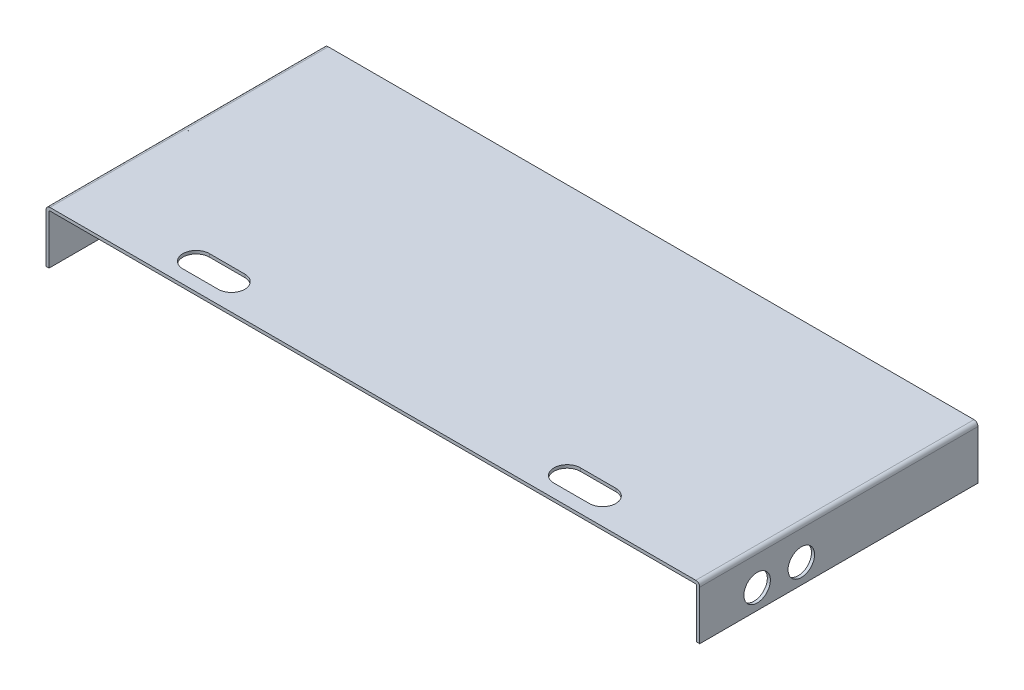
ISO-10303-21;
HEADER;
FILE_DESCRIPTION(('STEP AP214'),'2;1');
FILE_NAME('part.step','',(''),(''),'','','');
FILE_SCHEMA(('AUTOMOTIVE_DESIGN { 1 0 10303 214 1 1 1 1 }'));
ENDSEC;
DATA;
#1=APPLICATION_CONTEXT('core data for automotive mechanical design processes');
#2=APPLICATION_PROTOCOL_DEFINITION('international standard','automotive_design',2000,#1);
#3=PRODUCT_CONTEXT('',#1,'mechanical');
#4=PRODUCT('Part','Part','',(#3));
#5=PRODUCT_RELATED_PRODUCT_CATEGORY('part','',(#4));
#6=PRODUCT_DEFINITION_FORMATION('','',#4);
#7=PRODUCT_DEFINITION_CONTEXT('part definition',#1,'design');
#8=PRODUCT_DEFINITION('design','',#6,#7);
#9=PRODUCT_DEFINITION_SHAPE('','',#8);
#10=(LENGTH_UNIT() NAMED_UNIT(*) SI_UNIT(.MILLI.,.METRE.));
#11=(NAMED_UNIT(*) PLANE_ANGLE_UNIT() SI_UNIT($,.RADIAN.));
#12=(NAMED_UNIT(*) SI_UNIT($,.STERADIAN.) SOLID_ANGLE_UNIT());
#13=UNCERTAINTY_MEASURE_WITH_UNIT(LENGTH_MEASURE(1.E-05),#10,'distance_accuracy_value','');
#14=(GEOMETRIC_REPRESENTATION_CONTEXT(3) GLOBAL_UNCERTAINTY_ASSIGNED_CONTEXT((#13)) GLOBAL_UNIT_ASSIGNED_CONTEXT((#10,
#11,#12)) REPRESENTATION_CONTEXT('',''));
#15=CARTESIAN_POINT('',(0.,0.,0.));
#16=DIRECTION('',(0.,0.,1.));
#17=DIRECTION('',(1.,0.,0.));
#18=AXIS2_PLACEMENT_3D('',#15,#16,#17);
#19=CARTESIAN_POINT('',(-74.,-12.01,-23.));
#20=DIRECTION('',(0.,0.,1.));
#21=DIRECTION('',(1.,0.,0.));
#22=AXIS2_PLACEMENT_3D('',#19,#20,#21);
#23=PLANE('',#22);
#24=CARTESIAN_POINT('',(73.1,-0.900000000000012,-23.));
#25=DIRECTION('',(0.,0.,1.));
#26=DIRECTION('',(1.,0.,0.));
#27=AXIS2_PLACEMENT_3D('',#24,#25,#26);
#28=CIRCLE('',#27,0.899999999999992);
#29=CARTESIAN_POINT('',(73.1,0.,-23.));
#30=VERTEX_POINT('',#29);
#31=CARTESIAN_POINT('',(74.,-0.90000000000001,-23.));
#32=VERTEX_POINT('',#31);
#33=EDGE_CURVE('E247',#30,#32,#28,.F.);
#34=ORIENTED_EDGE('',*,*,#33,.T.);
#35=DIRECTION('',(0.,1.,0.));
#36=VECTOR('',#35,1.);
#37=CARTESIAN_POINT('',(74.,1.84206213535114E-13,-23.));
#38=LINE('',#37,#36);
#39=CARTESIAN_POINT('',(74.,-12.,-23.));
#40=VERTEX_POINT('',#39);
#41=EDGE_CURVE('E276',#40,#32,#38,.T.);
#42=ORIENTED_EDGE('',*,*,#41,.F.);
#43=DIRECTION('',(1.,0.,0.));
#44=VECTOR('',#43,1.);
#45=CARTESIAN_POINT('',(74.,-12.,-23.));
#46=LINE('',#45,#44);
#47=CARTESIAN_POINT('',(73.3,-12.,-23.));
#48=VERTEX_POINT('',#47);
#49=EDGE_CURVE('E275',#48,#40,#46,.T.);
#50=ORIENTED_EDGE('',*,*,#49,.F.);
#51=DIRECTION('',(0.,1.,0.));
#52=VECTOR('',#51,1.);
#53=CARTESIAN_POINT('',(73.3,1.81762176597924E-13,-23.));
#54=LINE('',#53,#52);
#55=CARTESIAN_POINT('',(73.3,-0.900000000000012,-23.));
#56=VERTEX_POINT('',#55);
#57=EDGE_CURVE('E250',#48,#56,#54,.T.);
#58=ORIENTED_EDGE('',*,*,#57,.T.);
#59=CARTESIAN_POINT('',(73.1,-0.900000000000012,-23.));
#60=DIRECTION('',(0.,0.,1.));
#61=DIRECTION('',(1.,0.,0.));
#62=AXIS2_PLACEMENT_3D('',#59,#60,#61);
#63=CIRCLE('',#62,0.199999999999992);
#64=CARTESIAN_POINT('',(73.1,-0.700000000000021,-23.));
#65=VERTEX_POINT('',#64);
#66=EDGE_CURVE('E272',#65,#56,#63,.F.);
#67=ORIENTED_EDGE('',*,*,#66,.F.);
#68=DIRECTION('',(1.,0.,0.));
#69=VECTOR('',#68,1.);
#70=CARTESIAN_POINT('',(0.,-0.7,-23.));
#71=LINE('',#70,#69);
#72=CARTESIAN_POINT('',(-73.1,-0.700000000000007,-23.));
#73=VERTEX_POINT('',#72);
#74=EDGE_CURVE('E200',#73,#65,#71,.T.);
#75=ORIENTED_EDGE('',*,*,#74,.F.);
#76=CARTESIAN_POINT('',(-73.1,-0.900000000000013,-23.));
#77=DIRECTION('',(0.,0.,1.));
#78=DIRECTION('',(1.,0.,0.));
#79=AXIS2_PLACEMENT_3D('',#76,#77,#78);
#80=CIRCLE('',#79,0.200000000000006);
#81=CARTESIAN_POINT('',(-73.3,-0.900000000000012,-23.));
#82=VERTEX_POINT('',#81);
#83=EDGE_CURVE('E197',#82,#73,#80,.F.);
#84=ORIENTED_EDGE('',*,*,#83,.F.);
#85=DIRECTION('',(0.,-1.,0.));
#86=VECTOR('',#85,1.);
#87=CARTESIAN_POINT('',(-73.3,2.72643264896886E-13,-23.));
#88=LINE('',#87,#86);
#89=CARTESIAN_POINT('',(-73.3,-12.,-23.));
#90=VERTEX_POINT('',#89);
#91=EDGE_CURVE('E43',#82,#90,#88,.T.);
#92=ORIENTED_EDGE('',*,*,#91,.T.);
#93=DIRECTION('',(1.,0.,0.));
#94=VECTOR('',#93,1.);
#95=CARTESIAN_POINT('',(-74.,-12.,-23.));
#96=LINE('',#95,#94);
#97=CARTESIAN_POINT('',(-74.,-12.,-23.));
#98=VERTEX_POINT('',#97);
#99=EDGE_CURVE('E280',#98,#90,#96,.T.);
#100=ORIENTED_EDGE('',*,*,#99,.F.);
#101=DIRECTION('',(0.,-1.,0.));
#102=VECTOR('',#101,1.);
#103=CARTESIAN_POINT('',(-74.,2.75087301834076E-13,-23.));
#104=LINE('',#103,#102);
#105=CARTESIAN_POINT('',(-74.,-0.900000000000009,-23.));
#106=VERTEX_POINT('',#105);
#107=EDGE_CURVE('E203',#106,#98,#104,.T.);
#108=ORIENTED_EDGE('',*,*,#107,.F.);
#109=CARTESIAN_POINT('',(-73.1,-0.900000000000013,-23.));
#110=DIRECTION('',(0.,0.,1.));
#111=DIRECTION('',(1.,0.,0.));
#112=AXIS2_PLACEMENT_3D('',#109,#110,#111);
#113=CIRCLE('',#112,0.900000000000006);
#114=CARTESIAN_POINT('',(-73.1,0.,-23.));
#115=VERTEX_POINT('',#114);
#116=EDGE_CURVE('E253',#106,#115,#113,.F.);
#117=ORIENTED_EDGE('',*,*,#116,.T.);
#118=DIRECTION('',(1.,0.,0.));
#119=VECTOR('',#118,1.);
#120=CARTESIAN_POINT('',(0.,0.,-23.));
#121=LINE('',#120,#119);
#122=EDGE_CURVE('E244',#115,#30,#121,.T.);
#123=ORIENTED_EDGE('',*,*,#122,.T.);
#124=EDGE_LOOP('',(#34,#42,#50,#58,#67,#75,#84,#92,#100,#108,#117,#123));
#125=FACE_BOUND('',#124,.T.);
#126=ADVANCED_FACE('F39',(#125),#23,.F.);
#127=CARTESIAN_POINT('',(-74.,-12.01,40.));
#128=DIRECTION('',(0.,0.,1.));
#129=DIRECTION('',(1.,0.,0.));
#130=AXIS2_PLACEMENT_3D('',#127,#128,#129);
#131=PLANE('',#130);
#132=CARTESIAN_POINT('',(73.1,-0.900000000000012,40.));
#133=DIRECTION('',(0.,0.,1.));
#134=DIRECTION('',(1.,0.,0.));
#135=AXIS2_PLACEMENT_3D('',#132,#133,#134);
#136=CIRCLE('',#135,0.899999999999992);
#137=CARTESIAN_POINT('',(73.1,0.,40.));
#138=VERTEX_POINT('',#137);
#139=CARTESIAN_POINT('',(74.,-0.90000000000001,40.));
#140=VERTEX_POINT('',#139);
#141=EDGE_CURVE('E269',#138,#140,#136,.F.);
#142=ORIENTED_EDGE('',*,*,#141,.F.);
#143=DIRECTION('',(1.,0.,0.));
#144=VECTOR('',#143,1.);
#145=CARTESIAN_POINT('',(0.,0.,40.));
#146=LINE('',#145,#144);
#147=CARTESIAN_POINT('',(-73.1,0.,40.));
#148=VERTEX_POINT('',#147);
#149=EDGE_CURVE('E266',#148,#138,#146,.T.);
#150=ORIENTED_EDGE('',*,*,#149,.F.);
#151=CARTESIAN_POINT('',(-73.1,-0.900000000000013,40.));
#152=DIRECTION('',(0.,0.,1.));
#153=DIRECTION('',(1.,0.,0.));
#154=AXIS2_PLACEMENT_3D('',#151,#152,#153);
#155=CIRCLE('',#154,0.900000000000006);
#156=CARTESIAN_POINT('',(-74.,-0.900000000000009,40.));
#157=VERTEX_POINT('',#156);
#158=EDGE_CURVE('E204',#157,#148,#155,.F.);
#159=ORIENTED_EDGE('',*,*,#158,.F.);
#160=DIRECTION('',(0.,-1.,0.));
#161=VECTOR('',#160,1.);
#162=CARTESIAN_POINT('',(-74.,2.75087301834076E-13,40.));
#163=LINE('',#162,#161);
#164=CARTESIAN_POINT('',(-74.,-12.,40.));
#165=VERTEX_POINT('',#164);
#166=EDGE_CURVE('E195',#157,#165,#163,.T.);
#167=ORIENTED_EDGE('',*,*,#166,.T.);
#168=DIRECTION('',(1.,0.,0.));
#169=VECTOR('',#168,1.);
#170=CARTESIAN_POINT('',(-74.,-12.,40.));
#171=LINE('',#170,#169);
#172=CARTESIAN_POINT('',(-73.3,-12.,40.));
#173=VERTEX_POINT('',#172);
#174=EDGE_CURVE('E281',#173,#165,#171,.F.);
#175=ORIENTED_EDGE('',*,*,#174,.F.);
#176=DIRECTION('',(0.,-1.,0.));
#177=VECTOR('',#176,1.);
#178=CARTESIAN_POINT('',(-73.3,2.72643264896886E-13,40.));
#179=LINE('',#178,#177);
#180=CARTESIAN_POINT('',(-73.3,-0.900000000000012,40.));
#181=VERTEX_POINT('',#180);
#182=EDGE_CURVE('E278',#181,#173,#179,.T.);
#183=ORIENTED_EDGE('',*,*,#182,.F.);
#184=CARTESIAN_POINT('',(-73.1,-0.900000000000013,40.));
#185=DIRECTION('',(0.,0.,1.));
#186=DIRECTION('',(1.,0.,0.));
#187=AXIS2_PLACEMENT_3D('',#184,#185,#186);
#188=CIRCLE('',#187,0.200000000000006);
#189=CARTESIAN_POINT('',(-73.1,-0.700000000000007,40.));
#190=VERTEX_POINT('',#189);
#191=EDGE_CURVE('E209',#181,#190,#188,.F.);
#192=ORIENTED_EDGE('',*,*,#191,.T.);
#193=DIRECTION('',(1.,0.,0.));
#194=VECTOR('',#193,1.);
#195=CARTESIAN_POINT('',(0.,-0.7,40.));
#196=LINE('',#195,#194);
#197=CARTESIAN_POINT('',(73.1,-0.700000000000021,40.));
#198=VERTEX_POINT('',#197);
#199=EDGE_CURVE('E246',#190,#198,#196,.T.);
#200=ORIENTED_EDGE('',*,*,#199,.T.);
#201=CARTESIAN_POINT('',(73.1,-0.900000000000012,40.));
#202=DIRECTION('',(0.,0.,1.));
#203=DIRECTION('',(1.,0.,0.));
#204=AXIS2_PLACEMENT_3D('',#201,#202,#203);
#205=CIRCLE('',#204,0.199999999999992);
#206=CARTESIAN_POINT('',(73.3,-0.900000000000012,40.));
#207=VERTEX_POINT('',#206);
#208=EDGE_CURVE('E249',#198,#207,#205,.F.);
#209=ORIENTED_EDGE('',*,*,#208,.T.);
#210=DIRECTION('',(0.,1.,0.));
#211=VECTOR('',#210,1.);
#212=CARTESIAN_POINT('',(73.3,1.81762176597924E-13,40.));
#213=LINE('',#212,#211);
#214=CARTESIAN_POINT('',(73.3,-12.,40.));
#215=VERTEX_POINT('',#214);
#216=EDGE_CURVE('E273',#215,#207,#213,.T.);
#217=ORIENTED_EDGE('',*,*,#216,.F.);
#218=DIRECTION('',(-1.,0.,0.));
#219=VECTOR('',#218,1.);
#220=CARTESIAN_POINT('',(74.,-12.,40.));
#221=LINE('',#220,#219);
#222=CARTESIAN_POINT('',(74.,-12.,40.));
#223=VERTEX_POINT('',#222);
#224=EDGE_CURVE('E283',#223,#215,#221,.T.);
#225=ORIENTED_EDGE('',*,*,#224,.F.);
#226=DIRECTION('',(0.,1.,0.));
#227=VECTOR('',#226,1.);
#228=CARTESIAN_POINT('',(74.,1.84206213535114E-13,40.));
#229=LINE('',#228,#227);
#230=EDGE_CURVE('E252',#223,#140,#229,.T.);
#231=ORIENTED_EDGE('',*,*,#230,.T.);
#232=EDGE_LOOP('',(#142,#150,#159,#167,#175,#183,#192,#200,#209,#217,#225,#231));
#233=FACE_BOUND('',#232,.T.);
#234=ADVANCED_FACE('F375',(#233),#131,.T.);
#235=CARTESIAN_POINT('',(-46.,-0.7,37.));
#236=DIRECTION('',(0.,0.,1.));
#237=DIRECTION('',(1.,0.,0.));
#238=AXIS2_PLACEMENT_3D('',#235,#236,#237);
#239=PLANE('',#238);
#240=DIRECTION('',(1.,0.,0.));
#241=VECTOR('',#240,1.);
#242=CARTESIAN_POINT('',(-46.,0.,37.));
#243=LINE('',#242,#241);
#244=CARTESIAN_POINT('',(-46.,0.,37.));
#245=VERTEX_POINT('',#244);
#246=CARTESIAN_POINT('',(-38.,0.,37.));
#247=VERTEX_POINT('',#246);
#248=EDGE_CURVE('E343',#245,#247,#243,.T.);
#249=ORIENTED_EDGE('',*,*,#248,.T.);
#250=DIRECTION('',(0.,1.,0.));
#251=VECTOR('',#250,1.);
#252=CARTESIAN_POINT('',(-38.,-0.7,37.));
#253=LINE('',#252,#251);
#254=CARTESIAN_POINT('',(-38.,-0.7,37.));
#255=VERTEX_POINT('',#254);
#256=EDGE_CURVE('E354',#255,#247,#253,.T.);
#257=ORIENTED_EDGE('',*,*,#256,.F.);
#258=DIRECTION('',(1.,0.,0.));
#259=VECTOR('',#258,1.);
#260=CARTESIAN_POINT('',(-46.,-0.7,37.));
#261=LINE('',#260,#259);
#262=CARTESIAN_POINT('',(-46.,-0.7,37.));
#263=VERTEX_POINT('',#262);
#264=EDGE_CURVE('E332',#263,#255,#261,.T.);
#265=ORIENTED_EDGE('',*,*,#264,.F.);
#266=DIRECTION('',(0.,1.,0.));
#267=VECTOR('',#266,1.);
#268=CARTESIAN_POINT('',(-46.,-0.7,37.));
#269=LINE('',#268,#267);
#270=EDGE_CURVE('E341',#263,#245,#269,.T.);
#271=ORIENTED_EDGE('',*,*,#270,.T.);
#272=EDGE_LOOP('',(#249,#257,#265,#271));
#273=FACE_BOUND('',#272,.T.);
#274=ADVANCED_FACE('F408',(#273),#239,.F.);
#275=CARTESIAN_POINT('',(-38.,-0.7,34.));
#276=DIRECTION('',(0.,1.,0.));
#277=DIRECTION('',(0.,0.,1.));
#278=AXIS2_PLACEMENT_3D('',#275,#276,#277);
#279=CYLINDRICAL_SURFACE('',#278,3.);
#280=CARTESIAN_POINT('',(-38.,0.,34.));
#281=DIRECTION('',(0.,1.,0.));
#282=DIRECTION('',(0.,0.,1.));
#283=AXIS2_PLACEMENT_3D('',#280,#281,#282);
#284=CIRCLE('',#283,3.);
#285=CARTESIAN_POINT('',(-38.,0.,31.));
#286=VERTEX_POINT('',#285);
#287=EDGE_CURVE('E346',#247,#286,#284,.T.);
#288=ORIENTED_EDGE('',*,*,#287,.T.);
#289=DIRECTION('',(0.,1.,0.));
#290=VECTOR('',#289,1.);
#291=CARTESIAN_POINT('',(-38.,-0.7,31.));
#292=LINE('',#291,#290);
#293=CARTESIAN_POINT('',(-38.,-0.7,31.));
#294=VERTEX_POINT('',#293);
#295=EDGE_CURVE('E352',#294,#286,#292,.T.);
#296=ORIENTED_EDGE('',*,*,#295,.F.);
#297=CARTESIAN_POINT('',(-38.,-0.7,34.));
#298=DIRECTION('',(0.,1.,0.));
#299=DIRECTION('',(0.,0.,1.));
#300=AXIS2_PLACEMENT_3D('',#297,#298,#299);
#301=CIRCLE('',#300,3.);
#302=EDGE_CURVE('E335',#255,#294,#301,.T.);
#303=ORIENTED_EDGE('',*,*,#302,.F.);
#304=ORIENTED_EDGE('',*,*,#256,.T.);
#305=EDGE_LOOP('',(#288,#296,#303,#304));
#306=FACE_BOUND('',#305,.T.);
#307=ADVANCED_FACE('F419',(#306),#279,.F.);
#308=CARTESIAN_POINT('',(-46.,-0.7,31.));
#309=DIRECTION('',(0.,0.,-1.));
#310=DIRECTION('',(-1.,0.,0.));
#311=AXIS2_PLACEMENT_3D('',#308,#309,#310);
#312=PLANE('',#311);
#313=DIRECTION('',(-1.,0.,0.));
#314=VECTOR('',#313,1.);
#315=CARTESIAN_POINT('',(-46.,0.,31.));
#316=LINE('',#315,#314);
#317=CARTESIAN_POINT('',(-46.,0.,31.));
#318=VERTEX_POINT('',#317);
#319=EDGE_CURVE('E331',#286,#318,#316,.T.);
#320=ORIENTED_EDGE('',*,*,#319,.T.);
#321=DIRECTION('',(0.,1.,0.));
#322=VECTOR('',#321,1.);
#323=CARTESIAN_POINT('',(-46.,-0.7,31.));
#324=LINE('',#323,#322);
#325=CARTESIAN_POINT('',(-46.,-0.7,31.));
#326=VERTEX_POINT('',#325);
#327=EDGE_CURVE('E285',#326,#318,#324,.T.);
#328=ORIENTED_EDGE('',*,*,#327,.F.);
#329=DIRECTION('',(-1.,0.,0.));
#330=VECTOR('',#329,1.);
#331=CARTESIAN_POINT('',(-46.,-0.7,31.));
#332=LINE('',#331,#330);
#333=EDGE_CURVE('E338',#294,#326,#332,.T.);
#334=ORIENTED_EDGE('',*,*,#333,.F.);
#335=ORIENTED_EDGE('',*,*,#295,.T.);
#336=EDGE_LOOP('',(#320,#328,#334,#335));
#337=FACE_BOUND('',#336,.T.);
#338=ADVANCED_FACE('F415',(#337),#312,.F.);
#339=CARTESIAN_POINT('',(-46.,-0.7,34.));
#340=DIRECTION('',(0.,1.,0.));
#341=DIRECTION('',(0.,0.,1.));
#342=AXIS2_PLACEMENT_3D('',#339,#340,#341);
#343=CYLINDRICAL_SURFACE('',#342,3.);
#344=CARTESIAN_POINT('',(-46.,0.,34.));
#345=DIRECTION('',(0.,1.,0.));
#346=DIRECTION('',(0.,0.,1.));
#347=AXIS2_PLACEMENT_3D('',#344,#345,#346);
#348=CIRCLE('',#347,3.);
#349=EDGE_CURVE('E324',#318,#245,#348,.T.);
#350=ORIENTED_EDGE('',*,*,#349,.T.);
#351=ORIENTED_EDGE('',*,*,#270,.F.);
#352=CARTESIAN_POINT('',(-46.,-0.7,34.));
#353=DIRECTION('',(0.,1.,0.));
#354=DIRECTION('',(0.,0.,1.));
#355=AXIS2_PLACEMENT_3D('',#352,#353,#354);
#356=CIRCLE('',#355,3.);
#357=EDGE_CURVE('E328',#326,#263,#356,.T.);
#358=ORIENTED_EDGE('',*,*,#357,.F.);
#359=ORIENTED_EDGE('',*,*,#327,.T.);
#360=EDGE_LOOP('',(#350,#351,#358,#359));
#361=FACE_BOUND('',#360,.T.);
#362=ADVANCED_FACE('F411',(#361),#343,.F.);
#363=CARTESIAN_POINT('',(38.,-0.7,37.));
#364=DIRECTION('',(0.,0.,1.));
#365=DIRECTION('',(1.,0.,0.));
#366=AXIS2_PLACEMENT_3D('',#363,#364,#365);
#367=PLANE('',#366);
#368=DIRECTION('',(1.,0.,0.));
#369=VECTOR('',#368,1.);
#370=CARTESIAN_POINT('',(38.,0.,37.));
#371=LINE('',#370,#369);
#372=CARTESIAN_POINT('',(38.,0.,37.));
#373=VERTEX_POINT('',#372);
#374=CARTESIAN_POINT('',(46.,0.,37.));
#375=VERTEX_POINT('',#374);
#376=EDGE_CURVE('E318',#373,#375,#371,.T.);
#377=ORIENTED_EDGE('',*,*,#376,.T.);
#378=DIRECTION('',(0.,1.,0.));
#379=VECTOR('',#378,1.);
#380=CARTESIAN_POINT('',(46.,-0.7,37.));
#381=LINE('',#380,#379);
#382=CARTESIAN_POINT('',(46.,-0.7,37.));
#383=VERTEX_POINT('',#382);
#384=EDGE_CURVE('E58',#383,#375,#381,.T.);
#385=ORIENTED_EDGE('',*,*,#384,.F.);
#386=DIRECTION('',(1.,0.,0.));
#387=VECTOR('',#386,1.);
#388=CARTESIAN_POINT('',(38.,-0.7,37.));
#389=LINE('',#388,#387);
#390=CARTESIAN_POINT('',(38.,-0.7,37.));
#391=VERTEX_POINT('',#390);
#392=EDGE_CURVE('E308',#391,#383,#389,.T.);
#393=ORIENTED_EDGE('',*,*,#392,.F.);
#394=DIRECTION('',(0.,1.,0.));
#395=VECTOR('',#394,1.);
#396=CARTESIAN_POINT('',(38.,-0.7,37.));
#397=LINE('',#396,#395);
#398=EDGE_CURVE('E77',#391,#373,#397,.T.);
#399=ORIENTED_EDGE('',*,*,#398,.T.);
#400=EDGE_LOOP('',(#377,#385,#393,#399));
#401=FACE_BOUND('',#400,.T.);
#402=ADVANCED_FACE('F414',(#401),#367,.F.);
#403=CARTESIAN_POINT('',(46.,-0.7,34.));
#404=DIRECTION('',(0.,1.,0.));
#405=DIRECTION('',(0.,0.,1.));
#406=AXIS2_PLACEMENT_3D('',#403,#404,#405);
#407=CYLINDRICAL_SURFACE('',#406,3.);
#408=CARTESIAN_POINT('',(46.,0.,34.));
#409=DIRECTION('',(0.,1.,0.));
#410=DIRECTION('',(0.,0.,1.));
#411=AXIS2_PLACEMENT_3D('',#408,#409,#410);
#412=CIRCLE('',#411,3.);
#413=CARTESIAN_POINT('',(46.,0.,31.));
#414=VERTEX_POINT('',#413);
#415=EDGE_CURVE('E320',#375,#414,#412,.T.);
#416=ORIENTED_EDGE('',*,*,#415,.T.);
#417=DIRECTION('',(0.,1.,0.));
#418=VECTOR('',#417,1.);
#419=CARTESIAN_POINT('',(46.,-0.7,31.));
#420=LINE('',#419,#418);
#421=CARTESIAN_POINT('',(46.,-0.7,31.));
#422=VERTEX_POINT('',#421);
#423=EDGE_CURVE('E70',#422,#414,#420,.T.);
#424=ORIENTED_EDGE('',*,*,#423,.F.);
#425=CARTESIAN_POINT('',(46.,-0.7,34.));
#426=DIRECTION('',(0.,1.,0.));
#427=DIRECTION('',(0.,0.,1.));
#428=AXIS2_PLACEMENT_3D('',#425,#426,#427);
#429=CIRCLE('',#428,3.);
#430=EDGE_CURVE('E311',#383,#422,#429,.T.);
#431=ORIENTED_EDGE('',*,*,#430,.F.);
#432=ORIENTED_EDGE('',*,*,#384,.T.);
#433=EDGE_LOOP('',(#416,#424,#431,#432));
#434=FACE_BOUND('',#433,.T.);
#435=ADVANCED_FACE('F432',(#434),#407,.F.);
#436=CARTESIAN_POINT('',(38.,-0.7,31.));
#437=DIRECTION('',(0.,0.,-1.));
#438=DIRECTION('',(-1.,0.,0.));
#439=AXIS2_PLACEMENT_3D('',#436,#437,#438);
#440=PLANE('',#439);
#441=DIRECTION('',(-1.,0.,0.));
#442=VECTOR('',#441,1.);
#443=CARTESIAN_POINT('',(38.,0.,31.));
#444=LINE('',#443,#442);
#445=CARTESIAN_POINT('',(38.,0.,31.));
#446=VERTEX_POINT('',#445);
#447=EDGE_CURVE('E307',#414,#446,#444,.T.);
#448=ORIENTED_EDGE('',*,*,#447,.T.);
#449=DIRECTION('',(0.,1.,0.));
#450=VECTOR('',#449,1.);
#451=CARTESIAN_POINT('',(38.,-0.7,31.));
#452=LINE('',#451,#450);
#453=CARTESIAN_POINT('',(38.,-0.7,31.));
#454=VERTEX_POINT('',#453);
#455=EDGE_CURVE('E80',#454,#446,#452,.T.);
#456=ORIENTED_EDGE('',*,*,#455,.F.);
#457=DIRECTION('',(-1.,0.,0.));
#458=VECTOR('',#457,1.);
#459=CARTESIAN_POINT('',(38.,-0.7,31.));
#460=LINE('',#459,#458);
#461=EDGE_CURVE('E314',#422,#454,#460,.T.);
#462=ORIENTED_EDGE('',*,*,#461,.F.);
#463=ORIENTED_EDGE('',*,*,#423,.T.);
#464=EDGE_LOOP('',(#448,#456,#462,#463));
#465=FACE_BOUND('',#464,.T.);
#466=ADVANCED_FACE('F429',(#465),#440,.F.);
#467=CARTESIAN_POINT('',(38.,-0.7,34.));
#468=DIRECTION('',(0.,1.,0.));
#469=DIRECTION('',(0.,0.,1.));
#470=AXIS2_PLACEMENT_3D('',#467,#468,#469);
#471=CYLINDRICAL_SURFACE('',#470,3.);
#472=CARTESIAN_POINT('',(38.,0.,34.));
#473=DIRECTION('',(0.,1.,0.));
#474=DIRECTION('',(0.,0.,1.));
#475=AXIS2_PLACEMENT_3D('',#472,#473,#474);
#476=CIRCLE('',#475,3.);
#477=EDGE_CURVE('E243',#446,#373,#476,.T.);
#478=ORIENTED_EDGE('',*,*,#477,.T.);
#479=ORIENTED_EDGE('',*,*,#398,.F.);
#480=CARTESIAN_POINT('',(38.,-0.7,34.));
#481=DIRECTION('',(0.,1.,0.));
#482=DIRECTION('',(0.,0.,1.));
#483=AXIS2_PLACEMENT_3D('',#480,#481,#482);
#484=CIRCLE('',#483,3.);
#485=EDGE_CURVE('E304',#454,#391,#484,.T.);
#486=ORIENTED_EDGE('',*,*,#485,.F.);
#487=ORIENTED_EDGE('',*,*,#455,.T.);
#488=EDGE_LOOP('',(#478,#479,#486,#487));
#489=FACE_BOUND('',#488,.T.);
#490=ADVANCED_FACE('F399',(#489),#471,.F.);
#491=CARTESIAN_POINT('',(0.,0.,0.));
#492=DIRECTION('',(0.,1.,0.));
#493=DIRECTION('',(0.,0.,1.));
#494=AXIS2_PLACEMENT_3D('',#491,#492,#493);
#495=PLANE('',#494);
#496=ORIENTED_EDGE('',*,*,#122,.F.);
#497=DIRECTION('',(0.,0.,-1.));
#498=VECTOR('',#497,1.);
#499=CARTESIAN_POINT('',(-73.1,0.,-45.));
#500=LINE('',#499,#498);
#501=EDGE_CURVE('E226',#115,#148,#500,.F.);
#502=ORIENTED_EDGE('',*,*,#501,.T.);
#503=ORIENTED_EDGE('',*,*,#149,.T.);
#504=DIRECTION('',(0.,0.,1.));
#505=VECTOR('',#504,1.);
#506=CARTESIAN_POINT('',(73.1,0.,45.));
#507=LINE('',#506,#505);
#508=EDGE_CURVE('E240',#138,#30,#507,.F.);
#509=ORIENTED_EDGE('',*,*,#508,.T.);
#510=EDGE_LOOP('',(#496,#502,#503,#509));
#511=FACE_BOUND('',#510,.T.);
#512=ORIENTED_EDGE('',*,*,#477,.F.);
#513=ORIENTED_EDGE('',*,*,#447,.F.);
#514=ORIENTED_EDGE('',*,*,#415,.F.);
#515=ORIENTED_EDGE('',*,*,#376,.F.);
#516=EDGE_LOOP('',(#512,#513,#514,#515));
#517=FACE_BOUND('',#516,.T.);
#518=ORIENTED_EDGE('',*,*,#349,.F.);
#519=ORIENTED_EDGE('',*,*,#319,.F.);
#520=ORIENTED_EDGE('',*,*,#287,.F.);
#521=ORIENTED_EDGE('',*,*,#248,.F.);
#522=EDGE_LOOP('',(#518,#519,#520,#521));
#523=FACE_BOUND('',#522,.T.);
#524=ADVANCED_FACE('F389',(#511,#517,#523),#495,.T.);
#525=CARTESIAN_POINT('',(0.,-0.7,0.));
#526=DIRECTION('',(0.,1.,0.));
#527=DIRECTION('',(0.,0.,1.));
#528=AXIS2_PLACEMENT_3D('',#525,#526,#527);
#529=PLANE('',#528);
#530=ORIENTED_EDGE('',*,*,#333,.T.);
#531=ORIENTED_EDGE('',*,*,#357,.T.);
#532=ORIENTED_EDGE('',*,*,#264,.T.);
#533=ORIENTED_EDGE('',*,*,#302,.T.);
#534=EDGE_LOOP('',(#530,#531,#532,#533));
#535=FACE_BOUND('',#534,.T.);
#536=ORIENTED_EDGE('',*,*,#461,.T.);
#537=ORIENTED_EDGE('',*,*,#485,.T.);
#538=ORIENTED_EDGE('',*,*,#392,.T.);
#539=ORIENTED_EDGE('',*,*,#430,.T.);
#540=EDGE_LOOP('',(#536,#537,#538,#539));
#541=FACE_BOUND('',#540,.T.);
#542=DIRECTION('',(0.,0.,-1.));
#543=VECTOR('',#542,1.);
#544=CARTESIAN_POINT('',(-73.1,-0.700000000000007,-45.));
#545=LINE('',#544,#543);
#546=EDGE_CURVE('E224',#73,#190,#545,.F.);
#547=ORIENTED_EDGE('',*,*,#546,.F.);
#548=ORIENTED_EDGE('',*,*,#74,.T.);
#549=DIRECTION('',(0.,0.,1.));
#550=VECTOR('',#549,1.);
#551=CARTESIAN_POINT('',(73.1,-0.700000000000021,45.));
#552=LINE('',#551,#550);
#553=EDGE_CURVE('E236',#198,#65,#552,.F.);
#554=ORIENTED_EDGE('',*,*,#553,.F.);
#555=ORIENTED_EDGE('',*,*,#199,.F.);
#556=EDGE_LOOP('',(#547,#548,#554,#555));
#557=FACE_BOUND('',#556,.T.);
#558=ADVANCED_FACE('F386',(#535,#541,#557),#529,.F.);
#559=CARTESIAN_POINT('',(-73.1,-0.900000000000013,-45.));
#560=DIRECTION('',(0.,0.,-1.));
#561=DIRECTION('',(-1.,0.,0.));
#562=AXIS2_PLACEMENT_3D('',#559,#560,#561);
#563=CYLINDRICAL_SURFACE('',#562,0.900000000000006);
#564=ORIENTED_EDGE('',*,*,#116,.F.);
#565=DIRECTION('',(0.,0.,-1.));
#566=VECTOR('',#565,1.);
#567=CARTESIAN_POINT('',(-74.,-0.900000000000009,45.));
#568=LINE('',#567,#566);
#569=EDGE_CURVE('E211',#106,#157,#568,.F.);
#570=ORIENTED_EDGE('',*,*,#569,.T.);
#571=ORIENTED_EDGE('',*,*,#158,.T.);
#572=ORIENTED_EDGE('',*,*,#501,.F.);
#573=EDGE_LOOP('',(#564,#570,#571,#572));
#574=FACE_BOUND('',#573,.T.);
#575=ADVANCED_FACE('F388',(#574),#563,.T.);
#576=CARTESIAN_POINT('',(-64.,-7.49999999999949,27.));
#577=DIRECTION('',(-1.,0.,0.));
#578=DIRECTION('',(0.,-1.,0.));
#579=AXIS2_PLACEMENT_3D('',#576,#577,#578);
#580=CYLINDRICAL_SURFACE('',#579,3.);
#581=CARTESIAN_POINT('',(-73.3,-7.49999999999946,27.));
#582=DIRECTION('',(1.,0.,0.));
#583=DIRECTION('',(0.,1.,0.));
#584=AXIS2_PLACEMENT_3D('',#581,#582,#583);
#585=CIRCLE('',#584,3.);
#586=CARTESIAN_POINT('',(-73.3,-4.49999999999946,27.));
#587=VERTEX_POINT('',#586);
#588=EDGE_CURVE('E214',#587,#587,#585,.T.);
#589=ORIENTED_EDGE('',*,*,#588,.T.);
#590=EDGE_LOOP('',(#589));
#591=FACE_BOUND('',#590,.T.);
#592=CARTESIAN_POINT('',(-74.,-7.49999999999946,27.));
#593=DIRECTION('',(-1.,0.,0.));
#594=DIRECTION('',(0.,-1.,0.));
#595=AXIS2_PLACEMENT_3D('',#592,#593,#594);
#596=CIRCLE('',#595,3.);
#597=CARTESIAN_POINT('',(-74.,-10.4999999999995,27.));
#598=VERTEX_POINT('',#597);
#599=EDGE_CURVE('E11',#598,#598,#596,.T.);
#600=ORIENTED_EDGE('',*,*,#599,.T.);
#601=EDGE_LOOP('',(#600));
#602=FACE_BOUND('',#601,.T.);
#603=ADVANCED_FACE('F396',(#591,#602),#580,.F.);
#604=CARTESIAN_POINT('',(-64.,-7.49999999999949,17.));
#605=DIRECTION('',(-1.,0.,0.));
#606=DIRECTION('',(0.,-1.,0.));
#607=AXIS2_PLACEMENT_3D('',#604,#605,#606);
#608=CYLINDRICAL_SURFACE('',#607,3.);
#609=CARTESIAN_POINT('',(-73.3,-7.49999999999946,17.));
#610=DIRECTION('',(1.,0.,0.));
#611=DIRECTION('',(0.,1.,0.));
#612=AXIS2_PLACEMENT_3D('',#609,#610,#611);
#613=CIRCLE('',#612,3.);
#614=CARTESIAN_POINT('',(-73.3,-4.49999999999946,17.));
#615=VERTEX_POINT('',#614);
#616=EDGE_CURVE('E210',#615,#615,#613,.T.);
#617=ORIENTED_EDGE('',*,*,#616,.T.);
#618=EDGE_LOOP('',(#617));
#619=FACE_BOUND('',#618,.T.);
#620=CARTESIAN_POINT('',(-74.,-7.49999999999946,17.));
#621=DIRECTION('',(-1.,0.,0.));
#622=DIRECTION('',(0.,-1.,0.));
#623=AXIS2_PLACEMENT_3D('',#620,#621,#622);
#624=CIRCLE('',#623,3.);
#625=CARTESIAN_POINT('',(-74.,-10.4999999999995,17.));
#626=VERTEX_POINT('',#625);
#627=EDGE_CURVE('E49',#626,#626,#624,.T.);
#628=ORIENTED_EDGE('',*,*,#627,.T.);
#629=EDGE_LOOP('',(#628));
#630=FACE_BOUND('',#629,.T.);
#631=ADVANCED_FACE('F457',(#619,#630),#608,.F.);
#632=CARTESIAN_POINT('',(-73.1,-0.900000000000013,-45.));
#633=DIRECTION('',(0.,0.,-1.));
#634=DIRECTION('',(-1.,0.,0.));
#635=AXIS2_PLACEMENT_3D('',#632,#633,#634);
#636=CYLINDRICAL_SURFACE('',#635,0.200000000000006);
#637=DIRECTION('',(0.,0.,-1.));
#638=VECTOR('',#637,1.);
#639=CARTESIAN_POINT('',(-73.3,-0.900000000000012,45.));
#640=LINE('',#639,#638);
#641=EDGE_CURVE('E190',#181,#82,#640,.T.);
#642=ORIENTED_EDGE('',*,*,#641,.T.);
#643=ORIENTED_EDGE('',*,*,#83,.T.);
#644=ORIENTED_EDGE('',*,*,#546,.T.);
#645=ORIENTED_EDGE('',*,*,#191,.F.);
#646=EDGE_LOOP('',(#642,#643,#644,#645));
#647=FACE_BOUND('',#646,.T.);
#648=ADVANCED_FACE('F207',(#647),#636,.F.);
#649=CARTESIAN_POINT('',(-73.3,2.72643264896886E-13,0.));
#650=DIRECTION('',(1.,0.,0.));
#651=DIRECTION('',(0.,1.,0.));
#652=AXIS2_PLACEMENT_3D('',#649,#650,#651);
#653=PLANE('',#652);
#654=ORIENTED_EDGE('',*,*,#91,.F.);
#655=ORIENTED_EDGE('',*,*,#641,.F.);
#656=ORIENTED_EDGE('',*,*,#182,.T.);
#657=DIRECTION('',(0.,0.,-1.));
#658=VECTOR('',#657,1.);
#659=CARTESIAN_POINT('',(-73.3,-12.,45.));
#660=LINE('',#659,#658);
#661=EDGE_CURVE('E192',#90,#173,#660,.F.);
#662=ORIENTED_EDGE('',*,*,#661,.F.);
#663=EDGE_LOOP('',(#654,#655,#656,#662));
#664=FACE_BOUND('',#663,.T.);
#665=ORIENTED_EDGE('',*,*,#616,.F.);
#666=EDGE_LOOP('',(#665));
#667=FACE_BOUND('',#666,.T.);
#668=ORIENTED_EDGE('',*,*,#588,.F.);
#669=EDGE_LOOP('',(#668));
#670=FACE_BOUND('',#669,.T.);
#671=ADVANCED_FACE('F186',(#664,#667,#670),#653,.T.);
#672=CARTESIAN_POINT('',(-74.,2.75087301834076E-13,0.));
#673=DIRECTION('',(1.,0.,0.));
#674=DIRECTION('',(0.,1.,0.));
#675=AXIS2_PLACEMENT_3D('',#672,#673,#674);
#676=PLANE('',#675);
#677=ORIENTED_EDGE('',*,*,#599,.F.);
#678=EDGE_LOOP('',(#677));
#679=FACE_BOUND('',#678,.T.);
#680=ORIENTED_EDGE('',*,*,#627,.F.);
#681=EDGE_LOOP('',(#680));
#682=FACE_BOUND('',#681,.T.);
#683=ORIENTED_EDGE('',*,*,#569,.F.);
#684=ORIENTED_EDGE('',*,*,#107,.T.);
#685=DIRECTION('',(0.,0.,1.));
#686=VECTOR('',#685,1.);
#687=CARTESIAN_POINT('',(-74.,-12.,0.));
#688=LINE('',#687,#686);
#689=EDGE_CURVE('E221',#98,#165,#688,.T.);
#690=ORIENTED_EDGE('',*,*,#689,.T.);
#691=ORIENTED_EDGE('',*,*,#166,.F.);
#692=EDGE_LOOP('',(#683,#684,#690,#691));
#693=FACE_BOUND('',#692,.T.);
#694=ADVANCED_FACE('F453',(#679,#682,#693),#676,.F.);
#695=CARTESIAN_POINT('',(-74.,-12.,45.));
#696=DIRECTION('',(0.,1.,0.));
#697=DIRECTION('',(-1.,0.,0.));
#698=AXIS2_PLACEMENT_3D('',#695,#696,#697);
#699=PLANE('',#698);
#700=ORIENTED_EDGE('',*,*,#689,.F.);
#701=ORIENTED_EDGE('',*,*,#99,.T.);
#702=ORIENTED_EDGE('',*,*,#661,.T.);
#703=ORIENTED_EDGE('',*,*,#174,.T.);
#704=EDGE_LOOP('',(#700,#701,#702,#703));
#705=FACE_BOUND('',#704,.T.);
#706=ADVANCED_FACE('F450',(#705),#699,.F.);
#707=CARTESIAN_POINT('',(73.1,-0.900000000000012,45.));
#708=DIRECTION('',(0.,0.,1.));
#709=DIRECTION('',(1.,0.,0.));
#710=AXIS2_PLACEMENT_3D('',#707,#708,#709);
#711=CYLINDRICAL_SURFACE('',#710,0.899999999999992);
#712=ORIENTED_EDGE('',*,*,#33,.F.);
#713=ORIENTED_EDGE('',*,*,#508,.F.);
#714=ORIENTED_EDGE('',*,*,#141,.T.);
#715=DIRECTION('',(0.,0.,1.));
#716=VECTOR('',#715,1.);
#717=CARTESIAN_POINT('',(74.,-0.90000000000001,-45.));
#718=LINE('',#717,#716);
#719=EDGE_CURVE('E232',#140,#32,#718,.F.);
#720=ORIENTED_EDGE('',*,*,#719,.T.);
#721=EDGE_LOOP('',(#712,#713,#714,#720));
#722=FACE_BOUND('',#721,.T.);
#723=ADVANCED_FACE('F448',(#722),#711,.T.);
#724=CARTESIAN_POINT('',(74.,-7.5,27.));
#725=DIRECTION('',(-1.,0.,0.));
#726=DIRECTION('',(0.,-1.,0.));
#727=AXIS2_PLACEMENT_3D('',#724,#725,#726);
#728=CYLINDRICAL_SURFACE('',#727,3.);
#729=CARTESIAN_POINT('',(74.,-7.5,27.));
#730=DIRECTION('',(-1.,0.,0.));
#731=DIRECTION('',(0.,-1.,0.));
#732=AXIS2_PLACEMENT_3D('',#729,#730,#731);
#733=CIRCLE('',#732,3.);
#734=CARTESIAN_POINT('',(74.,-10.5,27.));
#735=VERTEX_POINT('',#734);
#736=EDGE_CURVE('E299',#735,#735,#733,.F.);
#737=ORIENTED_EDGE('',*,*,#736,.T.);
#738=EDGE_LOOP('',(#737));
#739=FACE_BOUND('',#738,.T.);
#740=CARTESIAN_POINT('',(73.3,-7.5,27.));
#741=DIRECTION('',(-1.,0.,0.));
#742=DIRECTION('',(0.,-1.,0.));
#743=AXIS2_PLACEMENT_3D('',#740,#741,#742);
#744=CIRCLE('',#743,3.);
#745=CARTESIAN_POINT('',(73.3,-10.5,27.));
#746=VERTEX_POINT('',#745);
#747=EDGE_CURVE('E235',#746,#746,#744,.F.);
#748=ORIENTED_EDGE('',*,*,#747,.F.);
#749=EDGE_LOOP('',(#748));
#750=FACE_BOUND('',#749,.T.);
#751=ADVANCED_FACE('F444',(#739,#750),#728,.F.);
#752=CARTESIAN_POINT('',(74.,-7.5,17.));
#753=DIRECTION('',(-1.,0.,0.));
#754=DIRECTION('',(0.,-1.,0.));
#755=AXIS2_PLACEMENT_3D('',#752,#753,#754);
#756=CYLINDRICAL_SURFACE('',#755,3.);
#757=CARTESIAN_POINT('',(74.,-7.5,17.));
#758=DIRECTION('',(-1.,0.,0.));
#759=DIRECTION('',(0.,-1.,0.));
#760=AXIS2_PLACEMENT_3D('',#757,#758,#759);
#761=CIRCLE('',#760,3.);
#762=CARTESIAN_POINT('',(74.,-10.5,17.));
#763=VERTEX_POINT('',#762);
#764=EDGE_CURVE('E293',#763,#763,#761,.F.);
#765=ORIENTED_EDGE('',*,*,#764,.T.);
#766=EDGE_LOOP('',(#765));
#767=FACE_BOUND('',#766,.T.);
#768=CARTESIAN_POINT('',(73.3,-7.5,17.));
#769=DIRECTION('',(-1.,0.,0.));
#770=DIRECTION('',(0.,-1.,0.));
#771=AXIS2_PLACEMENT_3D('',#768,#769,#770);
#772=CIRCLE('',#771,3.);
#773=CARTESIAN_POINT('',(73.3,-10.5,17.));
#774=VERTEX_POINT('',#773);
#775=EDGE_CURVE('E296',#774,#774,#772,.F.);
#776=ORIENTED_EDGE('',*,*,#775,.F.);
#777=EDGE_LOOP('',(#776));
#778=FACE_BOUND('',#777,.T.);
#779=ADVANCED_FACE('F441',(#767,#778),#756,.F.);
#780=CARTESIAN_POINT('',(73.1,-0.900000000000012,45.));
#781=DIRECTION('',(0.,0.,1.));
#782=DIRECTION('',(1.,0.,0.));
#783=AXIS2_PLACEMENT_3D('',#780,#781,#782);
#784=CYLINDRICAL_SURFACE('',#783,0.199999999999992);
#785=ORIENTED_EDGE('',*,*,#553,.T.);
#786=ORIENTED_EDGE('',*,*,#66,.T.);
#787=DIRECTION('',(0.,0.,1.));
#788=VECTOR('',#787,1.);
#789=CARTESIAN_POINT('',(73.3,-0.900000000000012,-45.));
#790=LINE('',#789,#788);
#791=EDGE_CURVE('E229',#56,#207,#790,.T.);
#792=ORIENTED_EDGE('',*,*,#791,.T.);
#793=ORIENTED_EDGE('',*,*,#208,.F.);
#794=EDGE_LOOP('',(#785,#786,#792,#793));
#795=FACE_BOUND('',#794,.T.);
#796=ADVANCED_FACE('F383',(#795),#784,.F.);
#797=CARTESIAN_POINT('',(74.,1.84206213535114E-13,0.));
#798=DIRECTION('',(-1.,0.,0.));
#799=DIRECTION('',(0.,-1.,0.));
#800=AXIS2_PLACEMENT_3D('',#797,#798,#799);
#801=PLANE('',#800);
#802=ORIENTED_EDGE('',*,*,#764,.F.);
#803=EDGE_LOOP('',(#802));
#804=FACE_BOUND('',#803,.T.);
#805=ORIENTED_EDGE('',*,*,#736,.F.);
#806=EDGE_LOOP('',(#805));
#807=FACE_BOUND('',#806,.T.);
#808=DIRECTION('',(0.,0.,-1.));
#809=VECTOR('',#808,1.);
#810=CARTESIAN_POINT('',(74.,-12.,0.));
#811=LINE('',#810,#809);
#812=EDGE_CURVE('E239',#223,#40,#811,.T.);
#813=ORIENTED_EDGE('',*,*,#812,.T.);
#814=ORIENTED_EDGE('',*,*,#41,.T.);
#815=ORIENTED_EDGE('',*,*,#719,.F.);
#816=ORIENTED_EDGE('',*,*,#230,.F.);
#817=EDGE_LOOP('',(#813,#814,#815,#816));
#818=FACE_BOUND('',#817,.T.);
#819=ADVANCED_FACE('F374',(#804,#807,#818),#801,.F.);
#820=CARTESIAN_POINT('',(73.3,1.81762176597924E-13,0.));
#821=DIRECTION('',(-1.,0.,0.));
#822=DIRECTION('',(0.,-1.,0.));
#823=AXIS2_PLACEMENT_3D('',#820,#821,#822);
#824=PLANE('',#823);
#825=ORIENTED_EDGE('',*,*,#57,.F.);
#826=DIRECTION('',(0.,0.,1.));
#827=VECTOR('',#826,1.);
#828=CARTESIAN_POINT('',(73.3,-12.,-45.));
#829=LINE('',#828,#827);
#830=EDGE_CURVE('E290',#215,#48,#829,.F.);
#831=ORIENTED_EDGE('',*,*,#830,.F.);
#832=ORIENTED_EDGE('',*,*,#216,.T.);
#833=ORIENTED_EDGE('',*,*,#791,.F.);
#834=EDGE_LOOP('',(#825,#831,#832,#833));
#835=FACE_BOUND('',#834,.T.);
#836=ORIENTED_EDGE('',*,*,#775,.T.);
#837=EDGE_LOOP('',(#836));
#838=FACE_BOUND('',#837,.T.);
#839=ORIENTED_EDGE('',*,*,#747,.T.);
#840=EDGE_LOOP('',(#839));
#841=FACE_BOUND('',#840,.T.);
#842=ADVANCED_FACE('F41',(#835,#838,#841),#824,.T.);
#843=CARTESIAN_POINT('',(74.,-12.,-45.));
#844=DIRECTION('',(0.,1.,0.));
#845=DIRECTION('',(-1.,0.,0.));
#846=AXIS2_PLACEMENT_3D('',#843,#844,#845);
#847=PLANE('',#846);
#848=ORIENTED_EDGE('',*,*,#830,.T.);
#849=ORIENTED_EDGE('',*,*,#49,.T.);
#850=ORIENTED_EDGE('',*,*,#812,.F.);
#851=ORIENTED_EDGE('',*,*,#224,.T.);
#852=EDGE_LOOP('',(#848,#849,#850,#851));
#853=FACE_BOUND('',#852,.T.);
#854=ADVANCED_FACE('F369',(#853),#847,.F.);
#855=CLOSED_SHELL('',(#126,#234,#274,#307,#338,#362,#402,#435,#466,#490,#524,#558,#575,#603,
#631,#648,#671,#694,#706,#723,#751,#779,#796,#819,#842,#854));
#856=MANIFOLD_SOLID_BREP('B2',#855);
#857=ADVANCED_BREP_SHAPE_REPRESENTATION('',(#18,#856),#14);
#858=SHAPE_DEFINITION_REPRESENTATION(#9,#857);
ENDSEC;
END-ISO-10303-21;
